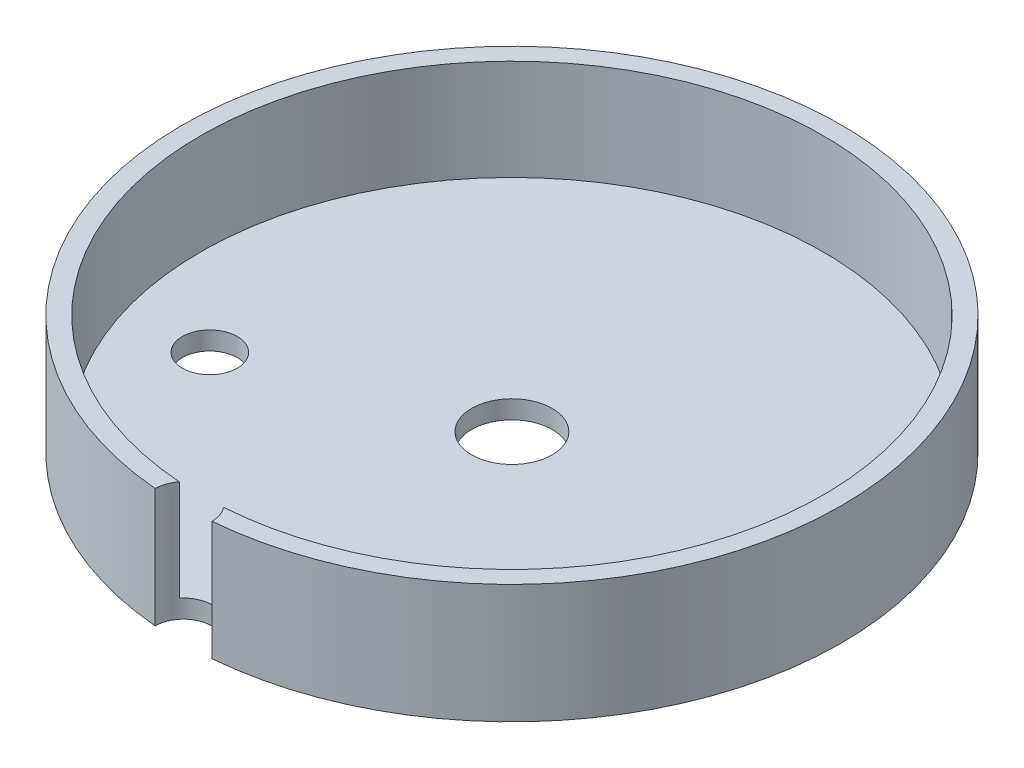
ISO-10303-21;
HEADER;
FILE_DESCRIPTION(('STEP AP214'),'2;1');
FILE_NAME('part.step','',(''),(''),'','','');
FILE_SCHEMA(('AUTOMOTIVE_DESIGN { 1 0 10303 214 1 1 1 1 }'));
ENDSEC;
DATA;
#1=APPLICATION_CONTEXT('core data for automotive mechanical design processes');
#2=APPLICATION_PROTOCOL_DEFINITION('international standard','automotive_design',2000,#1);
#3=PRODUCT_CONTEXT('',#1,'mechanical');
#4=PRODUCT('Part','Part','',(#3));
#5=PRODUCT_RELATED_PRODUCT_CATEGORY('part','',(#4));
#6=PRODUCT_DEFINITION_FORMATION('','',#4);
#7=PRODUCT_DEFINITION_CONTEXT('part definition',#1,'design');
#8=PRODUCT_DEFINITION('design','',#6,#7);
#9=PRODUCT_DEFINITION_SHAPE('','',#8);
#10=(LENGTH_UNIT() NAMED_UNIT(*) SI_UNIT(.MILLI.,.METRE.));
#11=(NAMED_UNIT(*) PLANE_ANGLE_UNIT() SI_UNIT($,.RADIAN.));
#12=(NAMED_UNIT(*) SI_UNIT($,.STERADIAN.) SOLID_ANGLE_UNIT());
#13=UNCERTAINTY_MEASURE_WITH_UNIT(LENGTH_MEASURE(1.E-05),#10,'distance_accuracy_value','');
#14=(GEOMETRIC_REPRESENTATION_CONTEXT(3) GLOBAL_UNCERTAINTY_ASSIGNED_CONTEXT((#13)) GLOBAL_UNIT_ASSIGNED_CONTEXT((#10,
#11,#12)) REPRESENTATION_CONTEXT('',''));
#15=CARTESIAN_POINT('',(0.,0.,0.));
#16=DIRECTION('',(0.,0.,1.));
#17=DIRECTION('',(1.,0.,0.));
#18=AXIS2_PLACEMENT_3D('',#15,#16,#17);
#19=CARTESIAN_POINT('',(0.,20.32,45.5501748734294));
#20=DIRECTION('',(0.,-1.,0.));
#21=DIRECTION('',(0.,0.,-1.));
#22=AXIS2_PLACEMENT_3D('',#19,#20,#21);
#23=CYLINDRICAL_SURFACE('',#22,3.937);
#24=CARTESIAN_POINT('',(0.,16.51,45.5501748734294));
#25=DIRECTION('',(0.,1.,0.));
#26=DIRECTION('',(0.,0.,1.));
#27=AXIS2_PLACEMENT_3D('',#24,#25,#26);
#28=CIRCLE('',#27,3.937);
#29=CARTESIAN_POINT('',(-3.937,16.51,45.5501748734294));
#30=VERTEX_POINT('',#29);
#31=CARTESIAN_POINT('',(-3.058799887373,16.51,43.0715235770573));
#32=VERTEX_POINT('',#31);
#33=EDGE_CURVE('E46',#30,#32,#28,.F.);
#34=ORIENTED_EDGE('',*,*,#33,.F.);
#35=DIRECTION('',(0.,-1.,0.));
#36=VECTOR('',#35,1.);
#37=CARTESIAN_POINT('',(-3.93700000000001,20.32,45.5501748734294));
#38=LINE('',#37,#36);
#39=CARTESIAN_POINT('',(-3.93700000000001,0.,45.5501748734294));
#40=VERTEX_POINT('',#39);
#41=EDGE_CURVE('E102',#30,#40,#38,.T.);
#42=ORIENTED_EDGE('',*,*,#41,.T.);
#43=CARTESIAN_POINT('',(0.,0.,45.5501748734294));
#44=DIRECTION('',(0.,-1.,0.));
#45=DIRECTION('',(0.,0.,1.));
#46=AXIS2_PLACEMENT_3D('',#43,#44,#45);
#47=CIRCLE('',#46,3.937);
#48=CARTESIAN_POINT('',(3.937,0.,45.5501748734294));
#49=VERTEX_POINT('',#48);
#50=EDGE_CURVE('E91',#40,#49,#47,.T.);
#51=ORIENTED_EDGE('',*,*,#50,.T.);
#52=DIRECTION('',(0.,-1.,0.));
#53=VECTOR('',#52,1.);
#54=CARTESIAN_POINT('',(3.937,20.32,45.5501748734294));
#55=LINE('',#54,#53);
#56=CARTESIAN_POINT('',(3.937,16.51,45.5501748734294));
#57=VERTEX_POINT('',#56);
#58=EDGE_CURVE('E87',#57,#49,#55,.T.);
#59=ORIENTED_EDGE('',*,*,#58,.F.);
#60=CARTESIAN_POINT('',(3.05879988737297,16.51,43.0715235770573));
#61=VERTEX_POINT('',#60);
#62=EDGE_CURVE('E11',#61,#57,#28,.F.);
#63=ORIENTED_EDGE('',*,*,#62,.F.);
#64=DIRECTION('',(0.,1.,0.));
#65=VECTOR('',#64,1.);
#66=CARTESIAN_POINT('',(3.058799887373,10.16,43.0715235770573));
#67=LINE('',#66,#65);
#68=CARTESIAN_POINT('',(3.05879988737294,2.54,43.0715235770573));
#69=VERTEX_POINT('',#68);
#70=EDGE_CURVE('E82',#61,#69,#67,.F.);
#71=ORIENTED_EDGE('',*,*,#70,.T.);
#72=CARTESIAN_POINT('',(0.,2.54,45.5501748734294));
#73=DIRECTION('',(0.,1.,0.));
#74=DIRECTION('',(0.,0.,1.));
#75=AXIS2_PLACEMENT_3D('',#72,#73,#74);
#76=CIRCLE('',#75,3.937);
#77=CARTESIAN_POINT('',(-3.05879988737294,2.54,43.0715235770573));
#78=VERTEX_POINT('',#77);
#79=EDGE_CURVE('E86',#78,#69,#76,.F.);
#80=ORIENTED_EDGE('',*,*,#79,.F.);
#81=DIRECTION('',(0.,1.,0.));
#82=VECTOR('',#81,1.);
#83=CARTESIAN_POINT('',(-3.058799887373,10.16,43.0715235770573));
#84=LINE('',#83,#82);
#85=EDGE_CURVE('E80',#78,#32,#84,.T.);
#86=ORIENTED_EDGE('',*,*,#85,.T.);
#87=EDGE_LOOP('',(#34,#42,#51,#59,#63,#71,#80,#86));
#88=FACE_BOUND('',#87,.T.);
#89=ADVANCED_FACE('F35',(#88),#23,.F.);
#90=CARTESIAN_POINT('',(0.,20.32,0.));
#91=DIRECTION('',(0.,-1.,0.));
#92=DIRECTION('',(0.,0.,-1.));
#93=AXIS2_PLACEMENT_3D('',#90,#91,#92);
#94=CYLINDRICAL_SURFACE('',#93,45.72);
#95=CARTESIAN_POINT('',(0.,16.51,0.));
#96=DIRECTION('',(0.,1.,0.));
#97=DIRECTION('',(0.,0.,1.));
#98=AXIS2_PLACEMENT_3D('',#95,#96,#97);
#99=CIRCLE('',#98,45.72);
#100=EDGE_CURVE('E72',#57,#30,#99,.T.);
#101=ORIENTED_EDGE('',*,*,#100,.F.);
#102=ORIENTED_EDGE('',*,*,#58,.T.);
#103=CARTESIAN_POINT('',(0.,0.,0.));
#104=DIRECTION('',(0.,1.,0.));
#105=DIRECTION('',(0.,0.,1.));
#106=AXIS2_PLACEMENT_3D('',#103,#104,#105);
#107=CIRCLE('',#106,45.72);
#108=EDGE_CURVE('E89',#49,#40,#107,.T.);
#109=ORIENTED_EDGE('',*,*,#108,.T.);
#110=ORIENTED_EDGE('',*,*,#41,.F.);
#111=EDGE_LOOP('',(#101,#102,#109,#110));
#112=FACE_BOUND('',#111,.T.);
#113=ADVANCED_FACE('F148',(#112),#94,.T.);
#114=CARTESIAN_POINT('',(0.,2.54,0.));
#115=DIRECTION('',(0.,1.,0.));
#116=DIRECTION('',(0.,0.,1.));
#117=AXIS2_PLACEMENT_3D('',#114,#115,#116);
#118=CYLINDRICAL_SURFACE('',#117,43.18);
#119=CARTESIAN_POINT('',(0.,16.51,0.));
#120=DIRECTION('',(0.,1.,0.));
#121=DIRECTION('',(0.,0.,1.));
#122=AXIS2_PLACEMENT_3D('',#119,#120,#121);
#123=CIRCLE('',#122,43.18);
#124=EDGE_CURVE('E44',#32,#61,#123,.F.);
#125=ORIENTED_EDGE('',*,*,#124,.F.);
#126=ORIENTED_EDGE('',*,*,#85,.F.);
#127=CARTESIAN_POINT('',(0.,2.54,0.));
#128=DIRECTION('',(0.,1.,0.));
#129=DIRECTION('',(0.,0.,1.));
#130=AXIS2_PLACEMENT_3D('',#127,#128,#129);
#131=CIRCLE('',#130,43.18);
#132=EDGE_CURVE('E106',#69,#78,#131,.T.);
#133=ORIENTED_EDGE('',*,*,#132,.F.);
#134=ORIENTED_EDGE('',*,*,#70,.F.);
#135=EDGE_LOOP('',(#125,#126,#133,#134));
#136=FACE_BOUND('',#135,.T.);
#137=ADVANCED_FACE('F78',(#136),#118,.F.);
#138=CARTESIAN_POINT('',(0.,20.32,0.));
#139=DIRECTION('',(0.,-1.,0.));
#140=DIRECTION('',(0.,0.,-1.));
#141=AXIS2_PLACEMENT_3D('',#138,#139,#140);
#142=CYLINDRICAL_SURFACE('',#141,5.588);
#143=CARTESIAN_POINT('',(0.,0.,0.));
#144=DIRECTION('',(0.,1.,0.));
#145=DIRECTION('',(0.,0.,1.));
#146=AXIS2_PLACEMENT_3D('',#143,#144,#145);
#147=CIRCLE('',#146,5.588);
#148=CARTESIAN_POINT('',(0.,0.,5.588));
#149=VERTEX_POINT('',#148);
#150=EDGE_CURVE('E97',#149,#149,#147,.T.);
#151=ORIENTED_EDGE('',*,*,#150,.F.);
#152=EDGE_LOOP('',(#151));
#153=FACE_BOUND('',#152,.T.);
#154=CARTESIAN_POINT('',(0.,2.54,0.));
#155=DIRECTION('',(0.,1.,0.));
#156=DIRECTION('',(0.,0.,1.));
#157=AXIS2_PLACEMENT_3D('',#154,#155,#156);
#158=CIRCLE('',#157,5.588);
#159=CARTESIAN_POINT('',(0.,2.54,5.588));
#160=VERTEX_POINT('',#159);
#161=EDGE_CURVE('E94',#160,#160,#158,.T.);
#162=ORIENTED_EDGE('',*,*,#161,.T.);
#163=EDGE_LOOP('',(#162));
#164=FACE_BOUND('',#163,.T.);
#165=ADVANCED_FACE('F156',(#153,#164),#142,.F.);
#166=CARTESIAN_POINT('',(0.,0.,22.7750874367147));
#167=DIRECTION('',(0.,1.,0.));
#168=DIRECTION('',(0.,0.,1.));
#169=AXIS2_PLACEMENT_3D('',#166,#167,#168);
#170=PLANE('',#169);
#171=CARTESIAN_POINT('',(-30.48,0.,11.43));
#172=DIRECTION('',(0.,1.,0.));
#173=DIRECTION('',(0.,0.,1.));
#174=AXIS2_PLACEMENT_3D('',#171,#172,#173);
#175=CIRCLE('',#174,3.81);
#176=CARTESIAN_POINT('',(-30.48,0.,15.24));
#177=VERTEX_POINT('',#176);
#178=EDGE_CURVE('E111',#177,#177,#175,.T.);
#179=ORIENTED_EDGE('',*,*,#178,.T.);
#180=EDGE_LOOP('',(#179));
#181=FACE_BOUND('',#180,.T.);
#182=CARTESIAN_POINT('',(30.48,0.,11.43));
#183=DIRECTION('',(0.,1.,0.));
#184=DIRECTION('',(0.,0.,-1.));
#185=AXIS2_PLACEMENT_3D('',#182,#183,#184);
#186=CIRCLE('',#185,3.81);
#187=CARTESIAN_POINT('',(30.48,0.,7.62));
#188=VERTEX_POINT('',#187);
#189=EDGE_CURVE('E116',#188,#188,#186,.T.);
#190=ORIENTED_EDGE('',*,*,#189,.T.);
#191=EDGE_LOOP('',(#190));
#192=FACE_BOUND('',#191,.T.);
#193=ORIENTED_EDGE('',*,*,#50,.F.);
#194=ORIENTED_EDGE('',*,*,#108,.F.);
#195=EDGE_LOOP('',(#193,#194));
#196=FACE_BOUND('',#195,.T.);
#197=ORIENTED_EDGE('',*,*,#150,.T.);
#198=EDGE_LOOP('',(#197));
#199=FACE_BOUND('',#198,.T.);
#200=ADVANCED_FACE('F124',(#181,#192,#196,#199),#170,.F.);
#201=CARTESIAN_POINT('',(0.,2.54,0.));
#202=DIRECTION('',(0.,1.,0.));
#203=DIRECTION('',(0.,0.,1.));
#204=AXIS2_PLACEMENT_3D('',#201,#202,#203);
#205=PLANE('',#204);
#206=CARTESIAN_POINT('',(-30.48,2.54,11.43));
#207=DIRECTION('',(0.,1.,0.));
#208=DIRECTION('',(0.,0.,1.));
#209=AXIS2_PLACEMENT_3D('',#206,#207,#208);
#210=CIRCLE('',#209,3.81);
#211=CARTESIAN_POINT('',(-30.48,2.54,15.24));
#212=VERTEX_POINT('',#211);
#213=EDGE_CURVE('E38',#212,#212,#210,.F.);
#214=ORIENTED_EDGE('',*,*,#213,.T.);
#215=EDGE_LOOP('',(#214));
#216=FACE_BOUND('',#215,.T.);
#217=CARTESIAN_POINT('',(30.48,2.54,11.43));
#218=DIRECTION('',(0.,1.,0.));
#219=DIRECTION('',(0.,0.,1.));
#220=AXIS2_PLACEMENT_3D('',#217,#218,#219);
#221=CIRCLE('',#220,3.81);
#222=CARTESIAN_POINT('',(30.48,2.54,15.24));
#223=VERTEX_POINT('',#222);
#224=EDGE_CURVE('E109',#223,#223,#221,.F.);
#225=ORIENTED_EDGE('',*,*,#224,.T.);
#226=EDGE_LOOP('',(#225));
#227=FACE_BOUND('',#226,.T.);
#228=ORIENTED_EDGE('',*,*,#161,.F.);
#229=EDGE_LOOP('',(#228));
#230=FACE_BOUND('',#229,.T.);
#231=ORIENTED_EDGE('',*,*,#79,.T.);
#232=ORIENTED_EDGE('',*,*,#132,.T.);
#233=EDGE_LOOP('',(#231,#232));
#234=FACE_BOUND('',#233,.T.);
#235=ADVANCED_FACE('F130',(#216,#227,#230,#234),#205,.T.);
#236=CARTESIAN_POINT('',(30.48,39.37,11.43));
#237=DIRECTION('',(0.,-1.,0.));
#238=DIRECTION('',(0.,0.,-1.));
#239=AXIS2_PLACEMENT_3D('',#236,#237,#238);
#240=CYLINDRICAL_SURFACE('',#239,3.81);
#241=ORIENTED_EDGE('',*,*,#224,.F.);
#242=EDGE_LOOP('',(#241));
#243=FACE_BOUND('',#242,.T.);
#244=ORIENTED_EDGE('',*,*,#189,.F.);
#245=EDGE_LOOP('',(#244));
#246=FACE_BOUND('',#245,.T.);
#247=ADVANCED_FACE('F127',(#243,#246),#240,.F.);
#248=CARTESIAN_POINT('',(-30.48,39.37,11.43));
#249=DIRECTION('',(0.,-1.,0.));
#250=DIRECTION('',(0.,0.,-1.));
#251=AXIS2_PLACEMENT_3D('',#248,#249,#250);
#252=CYLINDRICAL_SURFACE('',#251,3.81);
#253=ORIENTED_EDGE('',*,*,#213,.F.);
#254=EDGE_LOOP('',(#253));
#255=FACE_BOUND('',#254,.T.);
#256=ORIENTED_EDGE('',*,*,#178,.F.);
#257=EDGE_LOOP('',(#256));
#258=FACE_BOUND('',#257,.T.);
#259=ADVANCED_FACE('F129',(#255,#258),#252,.F.);
#260=CARTESIAN_POINT('',(72.898,16.51,-55.7376732664433));
#261=DIRECTION('',(0.,1.,0.));
#262=DIRECTION('',(0.,0.,1.));
#263=AXIS2_PLACEMENT_3D('',#260,#261,#262);
#264=PLANE('',#263);
#265=ORIENTED_EDGE('',*,*,#100,.T.);
#266=ORIENTED_EDGE('',*,*,#33,.T.);
#267=ORIENTED_EDGE('',*,*,#124,.T.);
#268=ORIENTED_EDGE('',*,*,#62,.T.);
#269=EDGE_LOOP('',(#265,#266,#267,#268));
#270=FACE_BOUND('',#269,.T.);
#271=ADVANCED_FACE('F71',(#270),#264,.T.);
#272=CLOSED_SHELL('',(#89,#113,#137,#165,#200,#235,#247,#259,#271));
#273=MANIFOLD_SOLID_BREP('B2',#272);
#274=ADVANCED_BREP_SHAPE_REPRESENTATION('',(#18,#273),#14);
#275=SHAPE_DEFINITION_REPRESENTATION(#9,#274);
ENDSEC;
END-ISO-10303-21;
